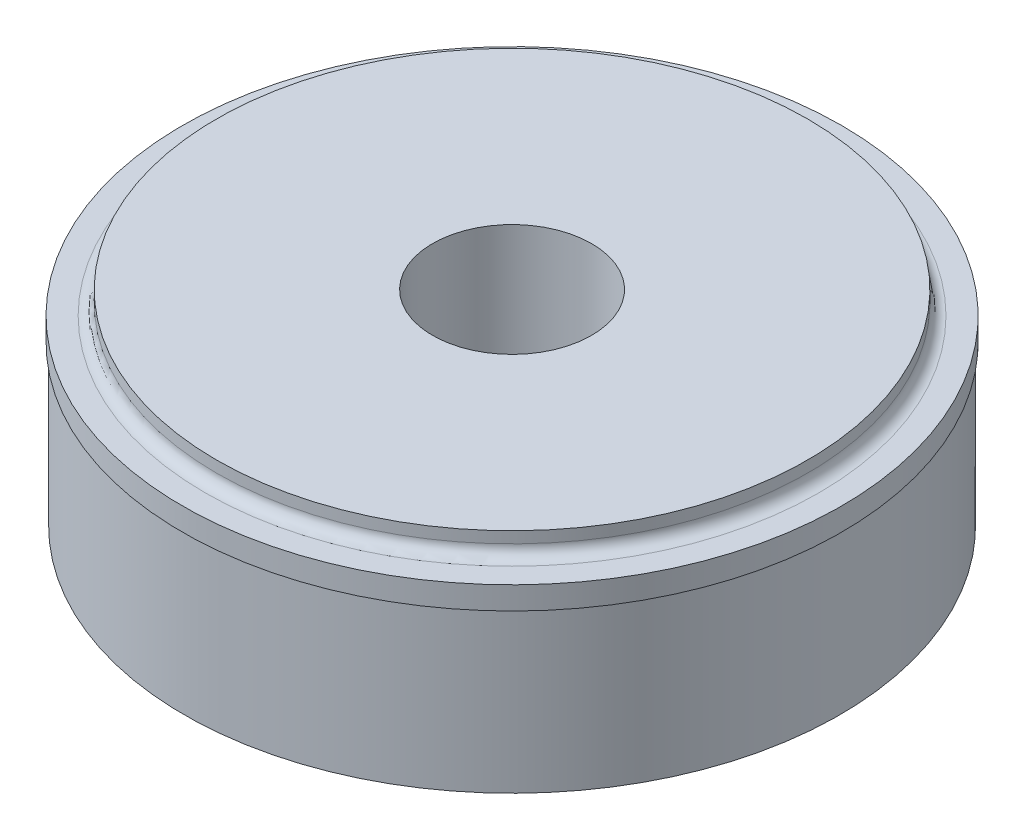
ISO-10303-21;
HEADER;
FILE_DESCRIPTION(('STEP AP214'),'2;1');
FILE_NAME('part.step','',(''),(''),'','','');
FILE_SCHEMA(('AUTOMOTIVE_DESIGN { 1 0 10303 214 1 1 1 1 }'));
ENDSEC;
DATA;
#1=APPLICATION_CONTEXT('core data for automotive mechanical design processes');
#2=APPLICATION_PROTOCOL_DEFINITION('international standard','automotive_design',2000,#1);
#3=PRODUCT_CONTEXT('',#1,'mechanical');
#4=PRODUCT('Part','Part','',(#3));
#5=PRODUCT_RELATED_PRODUCT_CATEGORY('part','',(#4));
#6=PRODUCT_DEFINITION_FORMATION('','',#4);
#7=PRODUCT_DEFINITION_CONTEXT('part definition',#1,'design');
#8=PRODUCT_DEFINITION('design','',#6,#7);
#9=PRODUCT_DEFINITION_SHAPE('','',#8);
#10=(LENGTH_UNIT() NAMED_UNIT(*) SI_UNIT(.MILLI.,.METRE.));
#11=(NAMED_UNIT(*) PLANE_ANGLE_UNIT() SI_UNIT($,.RADIAN.));
#12=(NAMED_UNIT(*) SI_UNIT($,.STERADIAN.) SOLID_ANGLE_UNIT());
#13=UNCERTAINTY_MEASURE_WITH_UNIT(LENGTH_MEASURE(1.E-05),#10,'distance_accuracy_value','');
#14=(GEOMETRIC_REPRESENTATION_CONTEXT(3) GLOBAL_UNCERTAINTY_ASSIGNED_CONTEXT((#13)) GLOBAL_UNIT_ASSIGNED_CONTEXT((#10,
#11,#12)) REPRESENTATION_CONTEXT('',''));
#15=CARTESIAN_POINT('',(0.,0.,0.));
#16=DIRECTION('',(0.,0.,1.));
#17=DIRECTION('',(1.,0.,0.));
#18=AXIS2_PLACEMENT_3D('',#15,#16,#17);
#19=CARTESIAN_POINT('',(0.,45.,65.));
#20=DIRECTION('',(0.,-1.,0.));
#21=DIRECTION('',(0.,0.,-1.));
#22=AXIS2_PLACEMENT_3D('',#19,#20,#21);
#23=PLANE('',#22);
#24=CARTESIAN_POINT('',(0.,45.,0.));
#25=DIRECTION('',(0.,-1.,0.));
#26=DIRECTION('',(0.,0.,-1.));
#27=AXIS2_PLACEMENT_3D('',#24,#25,#26);
#28=CIRCLE('',#27,65.);
#29=CARTESIAN_POINT('',(0.,45.,-65.));
#30=VERTEX_POINT('',#29);
#31=EDGE_CURVE('E10',#30,#30,#28,.T.);
#32=ORIENTED_EDGE('',*,*,#31,.F.);
#33=EDGE_LOOP('',(#32));
#34=FACE_BOUND('',#33,.T.);
#35=CARTESIAN_POINT('',(0.,45.,0.));
#36=DIRECTION('',(0.,-1.,0.));
#37=DIRECTION('',(0.,0.,-1.));
#38=AXIS2_PLACEMENT_3D('',#35,#36,#37);
#39=CIRCLE('',#38,17.5);
#40=CARTESIAN_POINT('',(0.,45.,-17.5));
#41=VERTEX_POINT('',#40);
#42=EDGE_CURVE('E65',#41,#41,#39,.T.);
#43=ORIENTED_EDGE('',*,*,#42,.T.);
#44=EDGE_LOOP('',(#43));
#45=FACE_BOUND('',#44,.T.);
#46=ADVANCED_FACE('F34',(#34,#45),#23,.F.);
#47=CARTESIAN_POINT('',(0.,0.,0.));
#48=DIRECTION('',(0.,-1.,0.));
#49=DIRECTION('',(0.,0.,-1.));
#50=AXIS2_PLACEMENT_3D('',#47,#48,#49);
#51=CYLINDRICAL_SURFACE('',#50,65.);
#52=CARTESIAN_POINT('',(0.,42.5,0.));
#53=DIRECTION('',(0.,-1.,0.));
#54=DIRECTION('',(0.,0.,-1.));
#55=AXIS2_PLACEMENT_3D('',#52,#53,#54);
#56=CIRCLE('',#55,65.);
#57=CARTESIAN_POINT('',(0.,42.5,-65.));
#58=VERTEX_POINT('',#57);
#59=EDGE_CURVE('E40',#58,#58,#56,.T.);
#60=ORIENTED_EDGE('',*,*,#59,.F.);
#61=EDGE_LOOP('',(#60));
#62=FACE_BOUND('',#61,.T.);
#63=ORIENTED_EDGE('',*,*,#31,.T.);
#64=EDGE_LOOP('',(#63));
#65=FACE_BOUND('',#64,.T.);
#66=ADVANCED_FACE('F108',(#62,#65),#51,.T.);
#67=CARTESIAN_POINT('',(0.,42.5,0.));
#68=DIRECTION('',(0.,-1.,0.));
#69=DIRECTION('',(0.,0.,-1.));
#70=AXIS2_PLACEMENT_3D('',#67,#68,#69);
#71=TOROIDAL_SURFACE('',#70,67.5,2.5);
#72=CARTESIAN_POINT('',(0.,40.,0.));
#73=DIRECTION('',(0.,-1.,0.));
#74=DIRECTION('',(0.,0.,-1.));
#75=AXIS2_PLACEMENT_3D('',#72,#73,#74);
#76=CIRCLE('',#75,67.5);
#77=CARTESIAN_POINT('',(0.,40.,-67.5));
#78=VERTEX_POINT('',#77);
#79=EDGE_CURVE('E44',#78,#78,#76,.T.);
#80=ORIENTED_EDGE('',*,*,#79,.F.);
#81=EDGE_LOOP('',(#80));
#82=FACE_BOUND('',#81,.T.);
#83=ORIENTED_EDGE('',*,*,#59,.T.);
#84=EDGE_LOOP('',(#83));
#85=FACE_BOUND('',#84,.T.);
#86=ADVANCED_FACE('F103',(#82,#85),#71,.F.);
#87=CARTESIAN_POINT('',(0.,40.,72.5));
#88=DIRECTION('',(0.,-1.,0.));
#89=DIRECTION('',(0.,0.,-1.));
#90=AXIS2_PLACEMENT_3D('',#87,#88,#89);
#91=PLANE('',#90);
#92=CARTESIAN_POINT('',(0.,40.,0.));
#93=DIRECTION('',(0.,-1.,0.));
#94=DIRECTION('',(0.,0.,-1.));
#95=AXIS2_PLACEMENT_3D('',#92,#93,#94);
#96=CIRCLE('',#95,72.5);
#97=CARTESIAN_POINT('',(0.,40.,-72.5));
#98=VERTEX_POINT('',#97);
#99=EDGE_CURVE('E48',#98,#98,#96,.T.);
#100=ORIENTED_EDGE('',*,*,#99,.F.);
#101=EDGE_LOOP('',(#100));
#102=FACE_BOUND('',#101,.T.);
#103=ORIENTED_EDGE('',*,*,#79,.T.);
#104=EDGE_LOOP('',(#103));
#105=FACE_BOUND('',#104,.T.);
#106=ADVANCED_FACE('F97',(#102,#105),#91,.F.);
#107=CARTESIAN_POINT('',(0.,0.,0.));
#108=DIRECTION('',(0.,-1.,0.));
#109=DIRECTION('',(0.,0.,-1.));
#110=AXIS2_PLACEMENT_3D('',#107,#108,#109);
#111=CYLINDRICAL_SURFACE('',#110,72.5);
#112=CARTESIAN_POINT('',(0.,35.,0.));
#113=DIRECTION('',(0.,-1.,0.));
#114=DIRECTION('',(0.,0.,-1.));
#115=AXIS2_PLACEMENT_3D('',#112,#113,#114);
#116=CIRCLE('',#115,72.5);
#117=CARTESIAN_POINT('',(0.,35.,-72.5));
#118=VERTEX_POINT('',#117);
#119=EDGE_CURVE('E53',#118,#118,#116,.T.);
#120=ORIENTED_EDGE('',*,*,#119,.F.);
#121=EDGE_LOOP('',(#120));
#122=FACE_BOUND('',#121,.T.);
#123=ORIENTED_EDGE('',*,*,#99,.T.);
#124=EDGE_LOOP('',(#123));
#125=FACE_BOUND('',#124,.T.);
#126=ADVANCED_FACE('F91',(#122,#125),#111,.T.);
#127=CARTESIAN_POINT('',(0.,35.,72.1));
#128=DIRECTION('',(0.,1.,0.));
#129=DIRECTION('',(0.,0.,1.));
#130=AXIS2_PLACEMENT_3D('',#127,#128,#129);
#131=PLANE('',#130);
#132=CARTESIAN_POINT('',(0.,35.,0.));
#133=DIRECTION('',(0.,-1.,0.));
#134=DIRECTION('',(0.,0.,-1.));
#135=AXIS2_PLACEMENT_3D('',#132,#133,#134);
#136=CIRCLE('',#135,72.1);
#137=CARTESIAN_POINT('',(0.,35.,-72.1));
#138=VERTEX_POINT('',#137);
#139=EDGE_CURVE('E56',#138,#138,#136,.T.);
#140=ORIENTED_EDGE('',*,*,#139,.F.);
#141=EDGE_LOOP('',(#140));
#142=FACE_BOUND('',#141,.T.);
#143=ORIENTED_EDGE('',*,*,#119,.T.);
#144=EDGE_LOOP('',(#143));
#145=FACE_BOUND('',#144,.T.);
#146=ADVANCED_FACE('F85',(#142,#145),#131,.F.);
#147=CARTESIAN_POINT('',(0.,0.,0.));
#148=DIRECTION('',(0.,-1.,0.));
#149=DIRECTION('',(0.,0.,-1.));
#150=AXIS2_PLACEMENT_3D('',#147,#148,#149);
#151=CYLINDRICAL_SURFACE('',#150,72.1);
#152=CARTESIAN_POINT('',(0.,0.,0.));
#153=DIRECTION('',(0.,-1.,0.));
#154=DIRECTION('',(0.,0.,-1.));
#155=AXIS2_PLACEMENT_3D('',#152,#153,#154);
#156=CIRCLE('',#155,72.1);
#157=CARTESIAN_POINT('',(0.,0.,-72.1));
#158=VERTEX_POINT('',#157);
#159=EDGE_CURVE('E59',#158,#158,#156,.T.);
#160=ORIENTED_EDGE('',*,*,#159,.F.);
#161=EDGE_LOOP('',(#160));
#162=FACE_BOUND('',#161,.T.);
#163=ORIENTED_EDGE('',*,*,#139,.T.);
#164=EDGE_LOOP('',(#163));
#165=FACE_BOUND('',#164,.T.);
#166=ADVANCED_FACE('F79',(#162,#165),#151,.T.);
#167=CARTESIAN_POINT('',(0.,0.,17.5));
#168=DIRECTION('',(0.,1.,0.));
#169=DIRECTION('',(0.,0.,1.));
#170=AXIS2_PLACEMENT_3D('',#167,#168,#169);
#171=PLANE('',#170);
#172=CARTESIAN_POINT('',(0.,0.,0.));
#173=DIRECTION('',(0.,-1.,0.));
#174=DIRECTION('',(0.,0.,-1.));
#175=AXIS2_PLACEMENT_3D('',#172,#173,#174);
#176=CIRCLE('',#175,17.5);
#177=CARTESIAN_POINT('',(0.,0.,-17.5));
#178=VERTEX_POINT('',#177);
#179=EDGE_CURVE('E62',#178,#178,#176,.T.);
#180=ORIENTED_EDGE('',*,*,#179,.F.);
#181=EDGE_LOOP('',(#180));
#182=FACE_BOUND('',#181,.T.);
#183=ORIENTED_EDGE('',*,*,#159,.T.);
#184=EDGE_LOOP('',(#183));
#185=FACE_BOUND('',#184,.T.);
#186=ADVANCED_FACE('F73',(#182,#185),#171,.F.);
#187=CARTESIAN_POINT('',(0.,0.,0.));
#188=DIRECTION('',(0.,-1.,0.));
#189=DIRECTION('',(0.,0.,-1.));
#190=AXIS2_PLACEMENT_3D('',#187,#188,#189);
#191=CYLINDRICAL_SURFACE('',#190,17.5);
#192=ORIENTED_EDGE('',*,*,#42,.F.);
#193=EDGE_LOOP('',(#192));
#194=FACE_BOUND('',#193,.T.);
#195=ORIENTED_EDGE('',*,*,#179,.T.);
#196=EDGE_LOOP('',(#195));
#197=FACE_BOUND('',#196,.T.);
#198=ADVANCED_FACE('F70',(#194,#197),#191,.F.);
#199=CLOSED_SHELL('',(#46,#66,#86,#106,#126,#146,#166,#186,#198));
#200=MANIFOLD_SOLID_BREP('B2',#199);
#201=ADVANCED_BREP_SHAPE_REPRESENTATION('',(#18,#200),#14);
#202=SHAPE_DEFINITION_REPRESENTATION(#9,#201);
ENDSEC;
END-ISO-10303-21;
